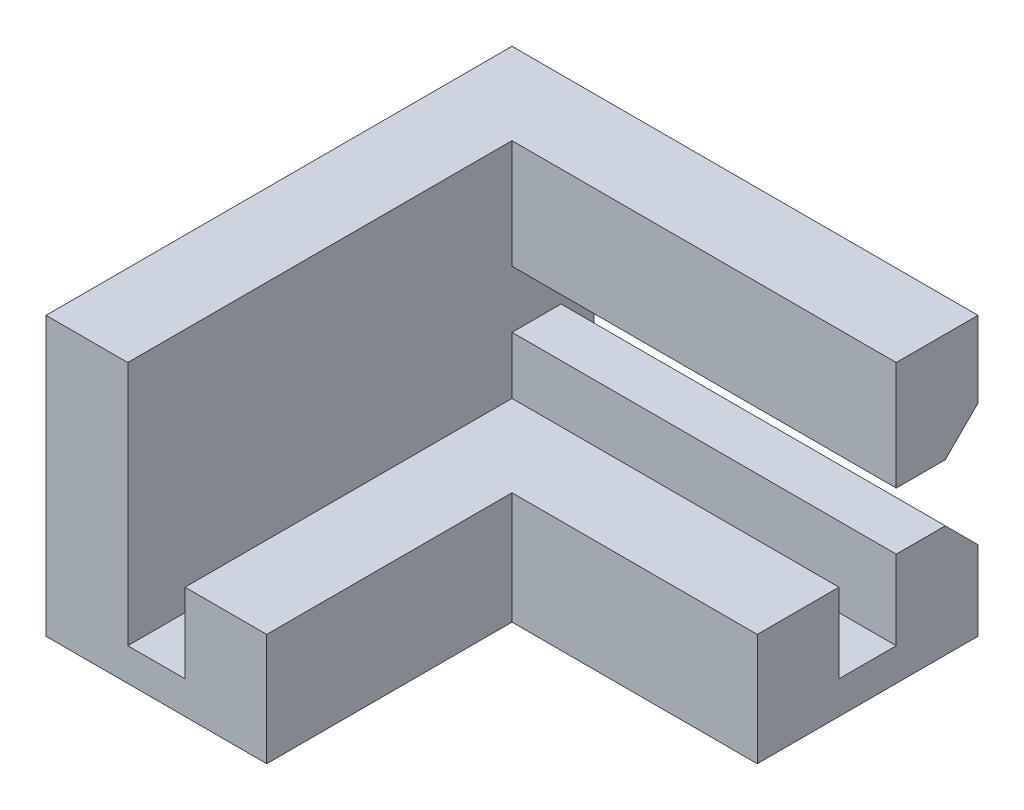
ISO-10303-21;
HEADER;
FILE_DESCRIPTION(('STEP AP214'),'2;1');
FILE_NAME('part.step','',(''),(''),'','','');
FILE_SCHEMA(('AUTOMOTIVE_DESIGN { 1 0 10303 214 1 1 1 1 }'));
ENDSEC;
DATA;
#1=APPLICATION_CONTEXT('core data for automotive mechanical design processes');
#2=APPLICATION_PROTOCOL_DEFINITION('international standard','automotive_design',2000,#1);
#3=PRODUCT_CONTEXT('',#1,'mechanical');
#4=PRODUCT('Part','Part','',(#3));
#5=PRODUCT_RELATED_PRODUCT_CATEGORY('part','',(#4));
#6=PRODUCT_DEFINITION_FORMATION('','',#4);
#7=PRODUCT_DEFINITION_CONTEXT('part definition',#1,'design');
#8=PRODUCT_DEFINITION('design','',#6,#7);
#9=PRODUCT_DEFINITION_SHAPE('','',#8);
#10=(LENGTH_UNIT() NAMED_UNIT(*) SI_UNIT(.MILLI.,.METRE.));
#11=(NAMED_UNIT(*) PLANE_ANGLE_UNIT() SI_UNIT($,.RADIAN.));
#12=(NAMED_UNIT(*) SI_UNIT($,.STERADIAN.) SOLID_ANGLE_UNIT());
#13=UNCERTAINTY_MEASURE_WITH_UNIT(LENGTH_MEASURE(1.E-05),#10,'distance_accuracy_value','');
#14=(GEOMETRIC_REPRESENTATION_CONTEXT(3) GLOBAL_UNCERTAINTY_ASSIGNED_CONTEXT((#13)) GLOBAL_UNIT_ASSIGNED_CONTEXT((#10,
#11,#12)) REPRESENTATION_CONTEXT('',''));
#15=CARTESIAN_POINT('',(0.,0.,0.));
#16=DIRECTION('',(0.,0.,1.));
#17=DIRECTION('',(1.,0.,0.));
#18=AXIS2_PLACEMENT_3D('',#15,#16,#17);
#19=CARTESIAN_POINT('',(-25.,15.,-9.39173583771506));
#20=DIRECTION('',(-1.,0.,0.));
#21=DIRECTION('',(0.,0.,-1.));
#22=AXIS2_PLACEMENT_3D('',#19,#20,#21);
#23=PLANE('',#22);
#24=DIRECTION('',(0.,-1.,0.));
#25=VECTOR('',#24,1.);
#26=CARTESIAN_POINT('',(-25.,15.,-9.39173583771506));
#27=LINE('',#26,#25);
#28=CARTESIAN_POINT('',(-25.,15.,-9.39173583771506));
#29=VERTEX_POINT('',#28);
#30=CARTESIAN_POINT('',(-25.,10.35,-9.39173583771506));
#31=VERTEX_POINT('',#30);
#32=EDGE_CURVE('E326',#29,#31,#27,.T.);
#33=ORIENTED_EDGE('',*,*,#32,.F.);
#34=DIRECTION('',(0.,0.,1.));
#35=VECTOR('',#34,1.);
#36=CARTESIAN_POINT('',(-25.,15.,-9.39173583771506));
#37=LINE('',#36,#35);
#38=CARTESIAN_POINT('',(-25.,15.,-4.39173583771506));
#39=VERTEX_POINT('',#38);
#40=EDGE_CURVE('E301',#29,#39,#37,.T.);
#41=ORIENTED_EDGE('',*,*,#40,.T.);
#42=DIRECTION('',(0.,1.,0.));
#43=VECTOR('',#42,1.);
#44=CARTESIAN_POINT('',(-25.,-33.2340187157677,-4.39173583771506));
#45=LINE('',#44,#43);
#46=CARTESIAN_POINT('',(-25.,8.35,-4.39173583771506));
#47=VERTEX_POINT('',#46);
#48=EDGE_CURVE('E217',#47,#39,#45,.T.);
#49=ORIENTED_EDGE('',*,*,#48,.F.);
#50=DIRECTION('',(0.,0.,1.));
#51=VECTOR('',#50,1.);
#52=CARTESIAN_POINT('',(-25.,8.35,-9.39173583771506));
#53=LINE('',#52,#51);
#54=CARTESIAN_POINT('',(-25.,8.35,-7.39173583771505));
#55=VERTEX_POINT('',#54);
#56=EDGE_CURVE('E205',#55,#47,#53,.T.);
#57=ORIENTED_EDGE('',*,*,#56,.F.);
#58=DIRECTION('',(0.,0.707106781186546,-0.707106781186549));
#59=VECTOR('',#58,1.);
#60=CARTESIAN_POINT('',(-25.,10.35,-9.39173583771506));
#61=LINE('',#60,#59);
#62=EDGE_CURVE('E346',#31,#55,#61,.F.);
#63=ORIENTED_EDGE('',*,*,#62,.F.);
#64=EDGE_LOOP('',(#33,#41,#49,#57,#63));
#65=FACE_BOUND('',#64,.T.);
#66=ADVANCED_FACE('F43',(#65),#23,.F.);
#67=CARTESIAN_POINT('',(-48.5,15.,-4.39173583771506));
#68=DIRECTION('',(0.,0.,1.));
#69=DIRECTION('',(-1.,0.,0.));
#70=AXIS2_PLACEMENT_3D('',#67,#68,#69);
#71=PLANE('',#70);
#72=DIRECTION('',(1.,0.,0.));
#73=VECTOR('',#72,1.);
#74=CARTESIAN_POINT('',(-48.5,8.35,-4.39173583771506));
#75=LINE('',#74,#73);
#76=CARTESIAN_POINT('',(-48.5,8.35,-4.39173583771506));
#77=VERTEX_POINT('',#76);
#78=EDGE_CURVE('E199',#77,#47,#75,.T.);
#79=ORIENTED_EDGE('',*,*,#78,.T.);
#80=ORIENTED_EDGE('',*,*,#48,.T.);
#81=DIRECTION('',(1.,0.,0.));
#82=VECTOR('',#81,1.);
#83=CARTESIAN_POINT('',(-48.5,15.,-4.39173583771506));
#84=LINE('',#83,#82);
#85=CARTESIAN_POINT('',(-48.5,15.,-4.39173583771506));
#86=VERTEX_POINT('',#85);
#87=EDGE_CURVE('E271',#86,#39,#84,.T.);
#88=ORIENTED_EDGE('',*,*,#87,.F.);
#89=DIRECTION('',(0.,-1.,0.));
#90=VECTOR('',#89,1.);
#91=CARTESIAN_POINT('',(-48.5,15.,-4.39173583771506));
#92=LINE('',#91,#90);
#93=EDGE_CURVE('E187',#86,#77,#92,.T.);
#94=ORIENTED_EDGE('',*,*,#93,.T.);
#95=EDGE_LOOP('',(#79,#80,#88,#94));
#96=FACE_BOUND('',#95,.T.);
#97=ADVANCED_FACE('F373',(#96),#71,.T.);
#98=CARTESIAN_POINT('',(-25.,15.,4.10826416228494));
#99=DIRECTION('',(0.,0.,-1.));
#100=DIRECTION('',(1.,0.,0.));
#101=AXIS2_PLACEMENT_3D('',#98,#99,#100);
#102=PLANE('',#101);
#103=DIRECTION('',(1.,0.,0.));
#104=VECTOR('',#103,1.);
#105=CARTESIAN_POINT('',(-25.,4.85,4.10826416228494));
#106=LINE('',#105,#104);
#107=CARTESIAN_POINT('',(-40.,4.85,4.10826416228494));
#108=VERTEX_POINT('',#107);
#109=CARTESIAN_POINT('',(-25.,4.85,4.10826416228494));
#110=VERTEX_POINT('',#109);
#111=EDGE_CURVE('E227',#108,#110,#106,.T.);
#112=ORIENTED_EDGE('',*,*,#111,.F.);
#113=DIRECTION('',(0.,-1.,0.));
#114=VECTOR('',#113,1.);
#115=CARTESIAN_POINT('',(-40.,15.,4.10826416228494));
#116=LINE('',#115,#114);
#117=CARTESIAN_POINT('',(-40.,-2.,4.10826416228494));
#118=VERTEX_POINT('',#117);
#119=EDGE_CURVE('E317',#108,#118,#116,.T.);
#120=ORIENTED_EDGE('',*,*,#119,.T.);
#121=DIRECTION('',(1.,0.,0.));
#122=VECTOR('',#121,1.);
#123=CARTESIAN_POINT('',(-25.,-2.,4.10826416228494));
#124=LINE('',#123,#122);
#125=CARTESIAN_POINT('',(-25.,-2.,4.10826416228494));
#126=VERTEX_POINT('',#125);
#127=EDGE_CURVE('E266',#118,#126,#124,.T.);
#128=ORIENTED_EDGE('',*,*,#127,.T.);
#129=DIRECTION('',(0.,-1.,0.));
#130=VECTOR('',#129,1.);
#131=CARTESIAN_POINT('',(-25.,15.,4.10826416228494));
#132=LINE('',#131,#130);
#133=EDGE_CURVE('E321',#110,#126,#132,.T.);
#134=ORIENTED_EDGE('',*,*,#133,.F.);
#135=EDGE_LOOP('',(#112,#120,#128,#134));
#136=FACE_BOUND('',#135,.T.);
#137=ADVANCED_FACE('F417',(#136),#102,.F.);
#138=CARTESIAN_POINT('',(-40.,15.,4.10826416228494));
#139=DIRECTION('',(-1.,0.,0.));
#140=DIRECTION('',(0.,0.,-1.));
#141=AXIS2_PLACEMENT_3D('',#138,#139,#140);
#142=PLANE('',#141);
#143=DIRECTION('',(0.,0.,-1.));
#144=VECTOR('',#143,1.);
#145=CARTESIAN_POINT('',(-40.,4.85,4.10826416228494));
#146=LINE('',#145,#144);
#147=CARTESIAN_POINT('',(-40.,4.85,19.1082641622849));
#148=VERTEX_POINT('',#147);
#149=EDGE_CURVE('E232',#148,#108,#146,.T.);
#150=ORIENTED_EDGE('',*,*,#149,.F.);
#151=DIRECTION('',(0.,-1.,0.));
#152=VECTOR('',#151,1.);
#153=CARTESIAN_POINT('',(-40.,15.,19.1082641622849));
#154=LINE('',#153,#152);
#155=CARTESIAN_POINT('',(-40.,-2.,19.1082641622849));
#156=VERTEX_POINT('',#155);
#157=EDGE_CURVE('E313',#148,#156,#154,.T.);
#158=ORIENTED_EDGE('',*,*,#157,.T.);
#159=DIRECTION('',(0.,0.,-1.));
#160=VECTOR('',#159,1.);
#161=CARTESIAN_POINT('',(-40.,-2.,4.10826416228494));
#162=LINE('',#161,#160);
#163=EDGE_CURVE('E263',#156,#118,#162,.T.);
#164=ORIENTED_EDGE('',*,*,#163,.T.);
#165=ORIENTED_EDGE('',*,*,#119,.F.);
#166=EDGE_LOOP('',(#150,#158,#164,#165));
#167=FACE_BOUND('',#166,.T.);
#168=ADVANCED_FACE('F429',(#167),#142,.F.);
#169=CARTESIAN_POINT('',(-30.,15.,-0.891735837715059));
#170=DIRECTION('',(0.,0.,-1.));
#171=DIRECTION('',(1.,0.,0.));
#172=AXIS2_PLACEMENT_3D('',#169,#170,#171);
#173=PLANE('',#172);
#174=DIRECTION('',(-1.,0.,0.));
#175=VECTOR('',#174,1.);
#176=CARTESIAN_POINT('',(-30.,0.,-0.891735837715059));
#177=LINE('',#176,#175);
#178=CARTESIAN_POINT('',(-25.,0.,-0.891735837715057));
#179=VERTEX_POINT('',#178);
#180=CARTESIAN_POINT('',(-45.,0.,-0.891735837715059));
#181=VERTEX_POINT('',#180);
#182=EDGE_CURVE('E278',#179,#181,#177,.T.);
#183=ORIENTED_EDGE('',*,*,#182,.T.);
#184=DIRECTION('',(0.,-1.,0.));
#185=VECTOR('',#184,1.);
#186=CARTESIAN_POINT('',(-45.,15.,-0.891735837715059));
#187=LINE('',#186,#185);
#188=CARTESIAN_POINT('',(-45.,4.85,-0.891735837715059));
#189=VERTEX_POINT('',#188);
#190=EDGE_CURVE('E290',#189,#181,#187,.T.);
#191=ORIENTED_EDGE('',*,*,#190,.F.);
#192=DIRECTION('',(-1.,0.,0.));
#193=VECTOR('',#192,1.);
#194=CARTESIAN_POINT('',(-30.,4.85,-0.891735837715059));
#195=LINE('',#194,#193);
#196=CARTESIAN_POINT('',(-25.,4.85,-0.891735837715058));
#197=VERTEX_POINT('',#196);
#198=EDGE_CURVE('E246',#197,#189,#195,.T.);
#199=ORIENTED_EDGE('',*,*,#198,.F.);
#200=DIRECTION('',(0.,1.,0.));
#201=VECTOR('',#200,1.);
#202=CARTESIAN_POINT('',(-25.,-33.2340187157677,-0.891735837715057));
#203=LINE('',#202,#201);
#204=EDGE_CURVE('E208',#179,#197,#203,.T.);
#205=ORIENTED_EDGE('',*,*,#204,.F.);
#206=EDGE_LOOP('',(#183,#191,#199,#205));
#207=FACE_BOUND('',#206,.T.);
#208=ADVANCED_FACE('F431',(#207),#173,.T.);
#209=CARTESIAN_POINT('',(-45.,15.,-0.891735837715059));
#210=DIRECTION('',(-1.,0.,0.));
#211=DIRECTION('',(0.,0.,-1.));
#212=AXIS2_PLACEMENT_3D('',#209,#210,#211);
#213=PLANE('',#212);
#214=ORIENTED_EDGE('',*,*,#190,.T.);
#215=DIRECTION('',(0.,0.,1.));
#216=VECTOR('',#215,1.);
#217=CARTESIAN_POINT('',(-45.,0.,-0.891735837715059));
#218=LINE('',#217,#216);
#219=CARTESIAN_POINT('',(-45.,0.,19.1082641622849));
#220=VERTEX_POINT('',#219);
#221=EDGE_CURVE('E282',#181,#220,#218,.T.);
#222=ORIENTED_EDGE('',*,*,#221,.T.);
#223=DIRECTION('',(0.,1.,0.));
#224=VECTOR('',#223,1.);
#225=CARTESIAN_POINT('',(-45.,-33.2340187157677,19.1082641622849));
#226=LINE('',#225,#224);
#227=CARTESIAN_POINT('',(-45.,4.85,19.1082641622849));
#228=VERTEX_POINT('',#227);
#229=EDGE_CURVE('E213',#220,#228,#226,.T.);
#230=ORIENTED_EDGE('',*,*,#229,.T.);
#231=DIRECTION('',(0.,0.,1.));
#232=VECTOR('',#231,1.);
#233=CARTESIAN_POINT('',(-45.,4.85,-0.891735837715059));
#234=LINE('',#233,#232);
#235=EDGE_CURVE('E238',#189,#228,#234,.T.);
#236=ORIENTED_EDGE('',*,*,#235,.F.);
#237=EDGE_LOOP('',(#214,#222,#230,#236));
#238=FACE_BOUND('',#237,.T.);
#239=ADVANCED_FACE('F410',(#238),#213,.T.);
#240=CARTESIAN_POINT('',(-30.,15.,0.));
#241=DIRECTION('',(0.,1.,0.));
#242=DIRECTION('',(0.,0.,1.));
#243=AXIS2_PLACEMENT_3D('',#240,#241,#242);
#244=PLANE('',#243);
#245=DIRECTION('',(0.,0.,-1.));
#246=VECTOR('',#245,1.);
#247=CARTESIAN_POINT('',(-48.5,15.,14.1082641622849));
#248=LINE('',#247,#246);
#249=CARTESIAN_POINT('',(-48.5,15.,19.1082641622849));
#250=VERTEX_POINT('',#249);
#251=EDGE_CURVE('E188',#250,#86,#248,.T.);
#252=ORIENTED_EDGE('',*,*,#251,.T.);
#253=ORIENTED_EDGE('',*,*,#87,.T.);
#254=ORIENTED_EDGE('',*,*,#40,.F.);
#255=DIRECTION('',(1.,0.,0.));
#256=VECTOR('',#255,1.);
#257=CARTESIAN_POINT('',(-53.5,15.,-9.39173583771506));
#258=LINE('',#257,#256);
#259=CARTESIAN_POINT('',(-53.5,15.,-9.39173583771506));
#260=VERTEX_POINT('',#259);
#261=EDGE_CURVE('E298',#260,#29,#258,.T.);
#262=ORIENTED_EDGE('',*,*,#261,.F.);
#263=DIRECTION('',(0.,0.,-1.));
#264=VECTOR('',#263,1.);
#265=CARTESIAN_POINT('',(-53.5,15.,19.1082641622849));
#266=LINE('',#265,#264);
#267=CARTESIAN_POINT('',(-53.5,15.,19.1082641622849));
#268=VERTEX_POINT('',#267);
#269=EDGE_CURVE('E294',#268,#260,#266,.T.);
#270=ORIENTED_EDGE('',*,*,#269,.F.);
#271=DIRECTION('',(-1.,0.,0.));
#272=VECTOR('',#271,1.);
#273=CARTESIAN_POINT('',(-40.,15.,19.1082641622849));
#274=LINE('',#273,#272);
#275=EDGE_CURVE('E305',#250,#268,#274,.T.);
#276=ORIENTED_EDGE('',*,*,#275,.F.);
#277=EDGE_LOOP('',(#252,#253,#254,#262,#270,#276));
#278=FACE_BOUND('',#277,.T.);
#279=ADVANCED_FACE('F379',(#278),#244,.T.);
#280=CARTESIAN_POINT('',(-53.5,15.,19.1082641622849));
#281=DIRECTION('',(1.,0.,0.));
#282=DIRECTION('',(0.,0.,1.));
#283=AXIS2_PLACEMENT_3D('',#280,#281,#282);
#284=PLANE('',#283);
#285=DIRECTION('',(0.,-1.,0.));
#286=VECTOR('',#285,1.);
#287=CARTESIAN_POINT('',(-53.5,15.,19.1082641622849));
#288=LINE('',#287,#286);
#289=CARTESIAN_POINT('',(-53.5,-2.,19.1082641622849));
#290=VERTEX_POINT('',#289);
#291=EDGE_CURVE('E309',#268,#290,#288,.T.);
#292=ORIENTED_EDGE('',*,*,#291,.F.);
#293=ORIENTED_EDGE('',*,*,#269,.T.);
#294=DIRECTION('',(0.,-1.,0.));
#295=VECTOR('',#294,1.);
#296=CARTESIAN_POINT('',(-53.5,15.,-9.39173583771506));
#297=LINE('',#296,#295);
#298=CARTESIAN_POINT('',(-53.5,-2.,-9.39173583771506));
#299=VERTEX_POINT('',#298);
#300=EDGE_CURVE('E330',#260,#299,#297,.T.);
#301=ORIENTED_EDGE('',*,*,#300,.T.);
#302=DIRECTION('',(0.,0.,1.));
#303=VECTOR('',#302,1.);
#304=CARTESIAN_POINT('',(-53.5,-2.,19.1082641622849));
#305=LINE('',#304,#303);
#306=EDGE_CURVE('E256',#299,#290,#305,.T.);
#307=ORIENTED_EDGE('',*,*,#306,.T.);
#308=EDGE_LOOP('',(#292,#293,#301,#307));
#309=FACE_BOUND('',#308,.T.);
#310=ADVANCED_FACE('F402',(#309),#284,.F.);
#311=CARTESIAN_POINT('',(-53.5,15.,-9.39173583771506));
#312=DIRECTION('',(0.,0.,1.));
#313=DIRECTION('',(-1.,0.,0.));
#314=AXIS2_PLACEMENT_3D('',#311,#312,#313);
#315=PLANE('',#314);
#316=CARTESIAN_POINT('',(-25.,2.84999999999999,-9.39173583771506));
#317=VERTEX_POINT('',#316);
#318=CARTESIAN_POINT('',(-25.,-2.,-9.39173583771506));
#319=VERTEX_POINT('',#318);
#320=EDGE_CURVE('E325',#317,#319,#27,.T.);
#321=ORIENTED_EDGE('',*,*,#320,.T.);
#322=DIRECTION('',(-1.,0.,0.));
#323=VECTOR('',#322,1.);
#324=CARTESIAN_POINT('',(-53.5,-2.,-9.39173583771506));
#325=LINE('',#324,#323);
#326=EDGE_CURVE('E253',#319,#299,#325,.T.);
#327=ORIENTED_EDGE('',*,*,#326,.T.);
#328=ORIENTED_EDGE('',*,*,#300,.F.);
#329=ORIENTED_EDGE('',*,*,#261,.T.);
#330=ORIENTED_EDGE('',*,*,#32,.T.);
#331=DIRECTION('',(1.,0.,0.));
#332=VECTOR('',#331,1.);
#333=CARTESIAN_POINT('',(-53.5,10.35,-9.39173583771506));
#334=LINE('',#333,#332);
#335=CARTESIAN_POINT('',(-48.5,10.35,-9.39173583771506));
#336=VERTEX_POINT('',#335);
#337=EDGE_CURVE('E334',#336,#31,#334,.T.);
#338=ORIENTED_EDGE('',*,*,#337,.F.);
#339=DIRECTION('',(0.,1.,0.));
#340=VECTOR('',#339,1.);
#341=CARTESIAN_POINT('',(-48.5,4.85,-9.39173583771506));
#342=LINE('',#341,#340);
#343=CARTESIAN_POINT('',(-48.5,2.85,-9.39173583771506));
#344=VERTEX_POINT('',#343);
#345=EDGE_CURVE('E177',#344,#336,#342,.T.);
#346=ORIENTED_EDGE('',*,*,#345,.F.);
#347=DIRECTION('',(-1.,0.,0.));
#348=VECTOR('',#347,1.);
#349=CARTESIAN_POINT('',(-53.5,2.84999999999999,-9.39173583771506));
#350=LINE('',#349,#348);
#351=EDGE_CURVE('E337',#317,#344,#350,.T.);
#352=ORIENTED_EDGE('',*,*,#351,.F.);
#353=EDGE_LOOP('',(#321,#327,#328,#329,#330,#338,#346,#352));
#354=FACE_BOUND('',#353,.T.);
#355=ADVANCED_FACE('F363',(#354),#315,.F.);
#356=DIRECTION('',(0.,0.,-1.));
#357=VECTOR('',#356,1.);
#358=CARTESIAN_POINT('',(-25.,4.85,-9.39173583771506));
#359=LINE('',#358,#357);
#360=CARTESIAN_POINT('',(-25.,4.85,-4.39173583771506));
#361=VERTEX_POINT('',#360);
#362=CARTESIAN_POINT('',(-25.,4.85,-7.39173583771505));
#363=VERTEX_POINT('',#362);
#364=EDGE_CURVE('E195',#361,#363,#359,.T.);
#365=ORIENTED_EDGE('',*,*,#364,.F.);
#366=CARTESIAN_POINT('',(-25.,0.,-4.39173583771506));
#367=VERTEX_POINT('',#366);
#368=EDGE_CURVE('E192',#367,#361,#45,.T.);
#369=ORIENTED_EDGE('',*,*,#368,.F.);
#370=DIRECTION('',(0.,0.,-1.));
#371=VECTOR('',#370,1.);
#372=CARTESIAN_POINT('',(-25.,0.,-0.891735837715057));
#373=LINE('',#372,#371);
#374=EDGE_CURVE('E212',#179,#367,#373,.T.);
#375=ORIENTED_EDGE('',*,*,#374,.F.);
#376=ORIENTED_EDGE('',*,*,#204,.T.);
#377=DIRECTION('',(0.,0.,-1.));
#378=VECTOR('',#377,1.);
#379=CARTESIAN_POINT('',(-25.,4.85,-0.891735837715059));
#380=LINE('',#379,#378);
#381=EDGE_CURVE('E224',#110,#197,#380,.T.);
#382=ORIENTED_EDGE('',*,*,#381,.F.);
#383=ORIENTED_EDGE('',*,*,#133,.T.);
#384=DIRECTION('',(0.,0.,-1.));
#385=VECTOR('',#384,1.);
#386=CARTESIAN_POINT('',(-25.,-2.,-9.39173583771506));
#387=LINE('',#386,#385);
#388=EDGE_CURVE('E250',#126,#319,#387,.T.);
#389=ORIENTED_EDGE('',*,*,#388,.T.);
#390=ORIENTED_EDGE('',*,*,#320,.F.);
#391=DIRECTION('',(0.,0.707106781186546,0.707106781186549));
#392=VECTOR('',#391,1.);
#393=CARTESIAN_POINT('',(-25.,2.84999999999999,-9.39173583771506));
#394=LINE('',#393,#392);
#395=EDGE_CURVE('E343',#363,#317,#394,.F.);
#396=ORIENTED_EDGE('',*,*,#395,.F.);
#397=EDGE_LOOP('',(#365,#369,#375,#376,#382,#383,#389,#390,#396));
#398=FACE_BOUND('',#397,.T.);
#399=ADVANCED_FACE('F392',(#398),#23,.F.);
#400=CARTESIAN_POINT('',(-40.,15.,19.1082641622849));
#401=DIRECTION('',(0.,0.,-1.));
#402=DIRECTION('',(1.,0.,0.));
#403=AXIS2_PLACEMENT_3D('',#400,#401,#402);
#404=PLANE('',#403);
#405=DIRECTION('',(0.,1.,0.));
#406=VECTOR('',#405,1.);
#407=CARTESIAN_POINT('',(-48.5,-33.2340187157677,19.1082641622849));
#408=LINE('',#407,#406);
#409=CARTESIAN_POINT('',(-48.5,0.,19.1082641622849));
#410=VERTEX_POINT('',#409);
#411=EDGE_CURVE('E228',#410,#250,#408,.T.);
#412=ORIENTED_EDGE('',*,*,#411,.T.);
#413=ORIENTED_EDGE('',*,*,#275,.T.);
#414=ORIENTED_EDGE('',*,*,#291,.T.);
#415=DIRECTION('',(1.,0.,0.));
#416=VECTOR('',#415,1.);
#417=CARTESIAN_POINT('',(-40.,-2.,19.1082641622849));
#418=LINE('',#417,#416);
#419=EDGE_CURVE('E260',#290,#156,#418,.T.);
#420=ORIENTED_EDGE('',*,*,#419,.T.);
#421=ORIENTED_EDGE('',*,*,#157,.F.);
#422=DIRECTION('',(1.,0.,0.));
#423=VECTOR('',#422,1.);
#424=CARTESIAN_POINT('',(-45.,4.85,19.1082641622849));
#425=LINE('',#424,#423);
#426=EDGE_CURVE('E235',#228,#148,#425,.T.);
#427=ORIENTED_EDGE('',*,*,#426,.F.);
#428=ORIENTED_EDGE('',*,*,#229,.F.);
#429=DIRECTION('',(1.,0.,0.));
#430=VECTOR('',#429,1.);
#431=CARTESIAN_POINT('',(-48.5,0.,19.1082641622849));
#432=LINE('',#431,#430);
#433=EDGE_CURVE('E209',#410,#220,#432,.T.);
#434=ORIENTED_EDGE('',*,*,#433,.F.);
#435=EDGE_LOOP('',(#412,#413,#414,#420,#421,#427,#428,#434));
#436=FACE_BOUND('',#435,.T.);
#437=ADVANCED_FACE('F384',(#436),#404,.F.);
#438=DIRECTION('',(-1.,0.,0.));
#439=VECTOR('',#438,1.);
#440=CARTESIAN_POINT('',(-48.5,4.85,-4.39173583771506));
#441=LINE('',#440,#439);
#442=CARTESIAN_POINT('',(-48.5,4.85,-4.39173583771506));
#443=VERTEX_POINT('',#442);
#444=EDGE_CURVE('E170',#361,#443,#441,.T.);
#445=ORIENTED_EDGE('',*,*,#444,.T.);
#446=CARTESIAN_POINT('',(-48.5,0.,-4.39173583771506));
#447=VERTEX_POINT('',#446);
#448=EDGE_CURVE('E180',#443,#447,#92,.T.);
#449=ORIENTED_EDGE('',*,*,#448,.T.);
#450=DIRECTION('',(1.,0.,0.));
#451=VECTOR('',#450,1.);
#452=CARTESIAN_POINT('',(-48.5,0.,-4.39173583771506));
#453=LINE('',#452,#451);
#454=EDGE_CURVE('E270',#447,#367,#453,.T.);
#455=ORIENTED_EDGE('',*,*,#454,.T.);
#456=ORIENTED_EDGE('',*,*,#368,.T.);
#457=EDGE_LOOP('',(#445,#449,#455,#456));
#458=FACE_BOUND('',#457,.T.);
#459=ADVANCED_FACE('F190',(#458),#71,.T.);
#460=CARTESIAN_POINT('',(-48.5,15.,14.1082641622849));
#461=DIRECTION('',(1.,0.,0.));
#462=DIRECTION('',(0.,0.,1.));
#463=AXIS2_PLACEMENT_3D('',#460,#461,#462);
#464=PLANE('',#463);
#465=ORIENTED_EDGE('',*,*,#411,.F.);
#466=DIRECTION('',(0.,0.,-1.));
#467=VECTOR('',#466,1.);
#468=CARTESIAN_POINT('',(-48.5,0.,14.1082641622849));
#469=LINE('',#468,#467);
#470=EDGE_CURVE('E183',#410,#447,#469,.T.);
#471=ORIENTED_EDGE('',*,*,#470,.T.);
#472=ORIENTED_EDGE('',*,*,#448,.F.);
#473=DIRECTION('',(0.,0.,1.));
#474=VECTOR('',#473,1.);
#475=CARTESIAN_POINT('',(-48.5,4.85,-9.39173583771506));
#476=LINE('',#475,#474);
#477=CARTESIAN_POINT('',(-48.5,4.85,-7.39173583771505));
#478=VERTEX_POINT('',#477);
#479=EDGE_CURVE('E165',#478,#443,#476,.T.);
#480=ORIENTED_EDGE('',*,*,#479,.F.);
#481=DIRECTION('',(0.,-0.707106781186546,-0.707106781186549));
#482=VECTOR('',#481,1.);
#483=CARTESIAN_POINT('',(-48.5,2.84999999999999,-9.39173583771506));
#484=LINE('',#483,#482);
#485=EDGE_CURVE('E52',#344,#478,#484,.F.);
#486=ORIENTED_EDGE('',*,*,#485,.F.);
#487=ORIENTED_EDGE('',*,*,#345,.T.);
#488=DIRECTION('',(0.,-0.707106781186546,0.707106781186549));
#489=VECTOR('',#488,1.);
#490=CARTESIAN_POINT('',(-48.5,10.35,-9.39173583771506));
#491=LINE('',#490,#489);
#492=CARTESIAN_POINT('',(-48.5,8.35,-7.39173583771505));
#493=VERTEX_POINT('',#492);
#494=EDGE_CURVE('E13',#493,#336,#491,.F.);
#495=ORIENTED_EDGE('',*,*,#494,.F.);
#496=DIRECTION('',(0.,0.,1.));
#497=VECTOR('',#496,1.);
#498=CARTESIAN_POINT('',(-48.5,8.35,-9.39173583771506));
#499=LINE('',#498,#497);
#500=EDGE_CURVE('E176',#493,#77,#499,.T.);
#501=ORIENTED_EDGE('',*,*,#500,.T.);
#502=ORIENTED_EDGE('',*,*,#93,.F.);
#503=ORIENTED_EDGE('',*,*,#251,.F.);
#504=EDGE_LOOP('',(#465,#471,#472,#480,#486,#487,#495,#501,#502,#503));
#505=FACE_BOUND('',#504,.T.);
#506=ADVANCED_FACE('F182',(#505),#464,.T.);
#507=CARTESIAN_POINT('',(-30.,0.,0.));
#508=DIRECTION('',(0.,1.,0.));
#509=DIRECTION('',(0.,0.,1.));
#510=AXIS2_PLACEMENT_3D('',#507,#508,#509);
#511=PLANE('',#510);
#512=ORIENTED_EDGE('',*,*,#470,.F.);
#513=ORIENTED_EDGE('',*,*,#433,.T.);
#514=ORIENTED_EDGE('',*,*,#221,.F.);
#515=ORIENTED_EDGE('',*,*,#182,.F.);
#516=ORIENTED_EDGE('',*,*,#374,.T.);
#517=ORIENTED_EDGE('',*,*,#454,.F.);
#518=EDGE_LOOP('',(#512,#513,#514,#515,#516,#517));
#519=FACE_BOUND('',#518,.T.);
#520=ADVANCED_FACE('F388',(#519),#511,.T.);
#521=CARTESIAN_POINT('',(-30.,-2.,0.));
#522=DIRECTION('',(0.,1.,0.));
#523=DIRECTION('',(0.,0.,1.));
#524=AXIS2_PLACEMENT_3D('',#521,#522,#523);
#525=PLANE('',#524);
#526=ORIENTED_EDGE('',*,*,#388,.F.);
#527=ORIENTED_EDGE('',*,*,#127,.F.);
#528=ORIENTED_EDGE('',*,*,#163,.F.);
#529=ORIENTED_EDGE('',*,*,#419,.F.);
#530=ORIENTED_EDGE('',*,*,#306,.F.);
#531=ORIENTED_EDGE('',*,*,#326,.F.);
#532=EDGE_LOOP('',(#526,#527,#528,#529,#530,#531));
#533=FACE_BOUND('',#532,.T.);
#534=ADVANCED_FACE('F399',(#533),#525,.F.);
#535=CARTESIAN_POINT('',(-30.,4.85,0.));
#536=DIRECTION('',(0.,1.,0.));
#537=DIRECTION('',(0.,0.,1.));
#538=AXIS2_PLACEMENT_3D('',#535,#536,#537);
#539=PLANE('',#538);
#540=ORIENTED_EDGE('',*,*,#426,.T.);
#541=ORIENTED_EDGE('',*,*,#149,.T.);
#542=ORIENTED_EDGE('',*,*,#111,.T.);
#543=ORIENTED_EDGE('',*,*,#381,.T.);
#544=ORIENTED_EDGE('',*,*,#198,.T.);
#545=ORIENTED_EDGE('',*,*,#235,.T.);
#546=EDGE_LOOP('',(#540,#541,#542,#543,#544,#545));
#547=FACE_BOUND('',#546,.T.);
#548=ADVANCED_FACE('F441',(#547),#539,.T.);
#549=CARTESIAN_POINT('',(-48.5,8.35,-9.39173583771506));
#550=DIRECTION('',(0.,1.,0.));
#551=DIRECTION('',(1.,0.,0.));
#552=AXIS2_PLACEMENT_3D('',#549,#550,#551);
#553=PLANE('',#552);
#554=ORIENTED_EDGE('',*,*,#56,.T.);
#555=ORIENTED_EDGE('',*,*,#78,.F.);
#556=ORIENTED_EDGE('',*,*,#500,.F.);
#557=DIRECTION('',(-1.,0.,0.));
#558=VECTOR('',#557,1.);
#559=CARTESIAN_POINT('',(-48.5,8.35,-7.39173583771505));
#560=LINE('',#559,#558);
#561=EDGE_CURVE('E58',#55,#493,#560,.T.);
#562=ORIENTED_EDGE('',*,*,#561,.F.);
#563=EDGE_LOOP('',(#554,#555,#556,#562));
#564=FACE_BOUND('',#563,.T.);
#565=ADVANCED_FACE('F371',(#564),#553,.F.);
#566=CARTESIAN_POINT('',(-25.,4.85,-9.39173583771506));
#567=DIRECTION('',(0.,-1.,0.));
#568=DIRECTION('',(0.,0.,-1.));
#569=AXIS2_PLACEMENT_3D('',#566,#567,#568);
#570=PLANE('',#569);
#571=ORIENTED_EDGE('',*,*,#479,.T.);
#572=ORIENTED_EDGE('',*,*,#444,.F.);
#573=ORIENTED_EDGE('',*,*,#364,.T.);
#574=DIRECTION('',(1.,0.,0.));
#575=VECTOR('',#574,1.);
#576=CARTESIAN_POINT('',(-25.,4.85,-7.39173583771505));
#577=LINE('',#576,#575);
#578=EDGE_CURVE('E172',#478,#363,#577,.T.);
#579=ORIENTED_EDGE('',*,*,#578,.F.);
#580=EDGE_LOOP('',(#571,#572,#573,#579));
#581=FACE_BOUND('',#580,.T.);
#582=ADVANCED_FACE('F167',(#581),#570,.F.);
#583=CARTESIAN_POINT('',(-53.5,2.84999999999999,-9.39173583771506));
#584=DIRECTION('',(0.,-0.707106781186549,0.707106781186546));
#585=DIRECTION('',(-1.,0.,0.));
#586=AXIS2_PLACEMENT_3D('',#583,#584,#585);
#587=PLANE('',#586);
#588=ORIENTED_EDGE('',*,*,#395,.T.);
#589=ORIENTED_EDGE('',*,*,#351,.T.);
#590=ORIENTED_EDGE('',*,*,#485,.T.);
#591=ORIENTED_EDGE('',*,*,#578,.T.);
#592=EDGE_LOOP('',(#588,#589,#590,#591));
#593=FACE_BOUND('',#592,.T.);
#594=ADVANCED_FACE('F352',(#593),#587,.F.);
#595=CARTESIAN_POINT('',(-53.5,10.35,-9.39173583771506));
#596=DIRECTION('',(0.,0.707106781186549,0.707106781186546));
#597=DIRECTION('',(1.,0.,0.));
#598=AXIS2_PLACEMENT_3D('',#595,#596,#597);
#599=PLANE('',#598);
#600=ORIENTED_EDGE('',*,*,#494,.T.);
#601=ORIENTED_EDGE('',*,*,#337,.T.);
#602=ORIENTED_EDGE('',*,*,#62,.T.);
#603=ORIENTED_EDGE('',*,*,#561,.T.);
#604=EDGE_LOOP('',(#600,#601,#602,#603));
#605=FACE_BOUND('',#604,.T.);
#606=ADVANCED_FACE('F45',(#605),#599,.F.);
#607=CLOSED_SHELL('',(#66,#97,#137,#168,#208,#239,#279,#310,#355,#399,#437,#459,#506,#520,#534,
#548,#565,#582,#594,#606));
#608=MANIFOLD_SOLID_BREP('B2',#607);
#609=ADVANCED_BREP_SHAPE_REPRESENTATION('',(#18,#608),#14);
#610=SHAPE_DEFINITION_REPRESENTATION(#9,#609);
ENDSEC;
END-ISO-10303-21;
